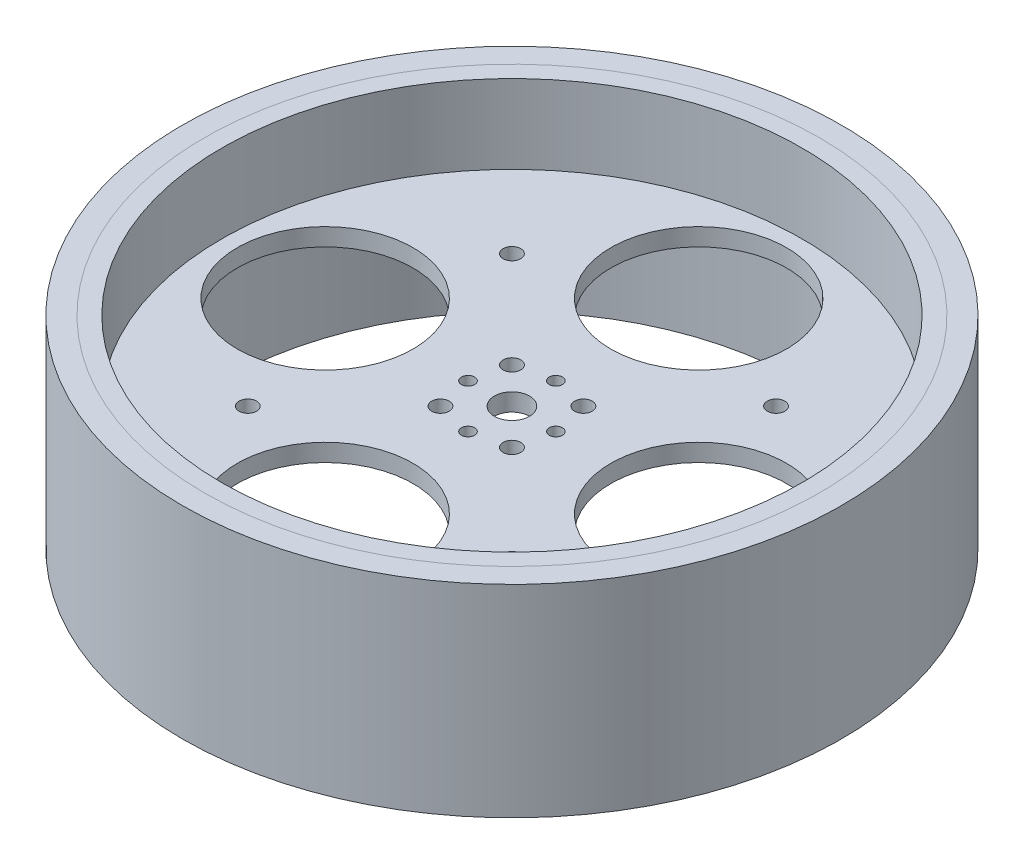
ISO-10303-21;
HEADER;
FILE_DESCRIPTION(('STEP AP214'),'2;1');
FILE_NAME('part.step','',(''),(''),'','','');
FILE_SCHEMA(('AUTOMOTIVE_DESIGN { 1 0 10303 214 1 1 1 1 }'));
ENDSEC;
DATA;
#1=APPLICATION_CONTEXT('core data for automotive mechanical design processes');
#2=APPLICATION_PROTOCOL_DEFINITION('international standard','automotive_design',2000,#1);
#3=PRODUCT_CONTEXT('',#1,'mechanical');
#4=PRODUCT('Part','Part','',(#3));
#5=PRODUCT_RELATED_PRODUCT_CATEGORY('part','',(#4));
#6=PRODUCT_DEFINITION_FORMATION('','',#4);
#7=PRODUCT_DEFINITION_CONTEXT('part definition',#1,'design');
#8=PRODUCT_DEFINITION('design','',#6,#7);
#9=PRODUCT_DEFINITION_SHAPE('','',#8);
#10=(LENGTH_UNIT() NAMED_UNIT(*) SI_UNIT(.MILLI.,.METRE.));
#11=(NAMED_UNIT(*) PLANE_ANGLE_UNIT() SI_UNIT($,.RADIAN.));
#12=(NAMED_UNIT(*) SI_UNIT($,.STERADIAN.) SOLID_ANGLE_UNIT());
#13=UNCERTAINTY_MEASURE_WITH_UNIT(LENGTH_MEASURE(1.E-05),#10,'distance_accuracy_value','');
#14=(GEOMETRIC_REPRESENTATION_CONTEXT(3) GLOBAL_UNCERTAINTY_ASSIGNED_CONTEXT((#13)) GLOBAL_UNIT_ASSIGNED_CONTEXT((#10,
#11,#12)) REPRESENTATION_CONTEXT('',''));
#15=CARTESIAN_POINT('',(0.,0.,0.));
#16=DIRECTION('',(0.,0.,1.));
#17=DIRECTION('',(1.,0.,0.));
#18=AXIS2_PLACEMENT_3D('',#15,#16,#17);
#19=CARTESIAN_POINT('',(0.,-26.1,0.));
#20=DIRECTION('',(0.,1.,0.));
#21=DIRECTION('',(0.,0.,1.));
#22=AXIS2_PLACEMENT_3D('',#19,#20,#21);
#23=CYLINDRICAL_SURFACE('',#22,70.);
#24=CARTESIAN_POINT('',(0.,-26.1,0.));
#25=DIRECTION('',(0.,1.,0.));
#26=DIRECTION('',(0.,0.,1.));
#27=AXIS2_PLACEMENT_3D('',#24,#25,#26);
#28=CIRCLE('',#27,70.);
#29=CARTESIAN_POINT('',(0.,-26.1,70.));
#30=VERTEX_POINT('',#29);
#31=EDGE_CURVE('E59',#30,#30,#28,.T.);
#32=ORIENTED_EDGE('',*,*,#31,.F.);
#33=EDGE_LOOP('',(#32));
#34=FACE_BOUND('',#33,.T.);
#35=CARTESIAN_POINT('',(0.,19.9,0.));
#36=DIRECTION('',(0.,1.,0.));
#37=DIRECTION('',(0.,0.,1.));
#38=AXIS2_PLACEMENT_3D('',#35,#36,#37);
#39=CIRCLE('',#38,70.);
#40=CARTESIAN_POINT('',(0.,19.9,70.));
#41=VERTEX_POINT('',#40);
#42=EDGE_CURVE('E67',#41,#41,#39,.T.);
#43=ORIENTED_EDGE('',*,*,#42,.T.);
#44=EDGE_LOOP('',(#43));
#45=FACE_BOUND('',#44,.T.);
#46=ADVANCED_FACE('F53',(#34,#45),#23,.F.);
#47=CARTESIAN_POINT('',(0.,-26.1,0.));
#48=DIRECTION('',(0.,1.,0.));
#49=DIRECTION('',(0.,0.,1.));
#50=AXIS2_PLACEMENT_3D('',#47,#48,#49);
#51=CYLINDRICAL_SURFACE('',#50,75.);
#52=CARTESIAN_POINT('',(0.,-26.1,0.));
#53=DIRECTION('',(0.,1.,0.));
#54=DIRECTION('',(0.,0.,1.));
#55=AXIS2_PLACEMENT_3D('',#52,#53,#54);
#56=CIRCLE('',#55,75.);
#57=CARTESIAN_POINT('',(0.,-26.1,75.));
#58=VERTEX_POINT('',#57);
#59=EDGE_CURVE('E11',#58,#58,#56,.T.);
#60=ORIENTED_EDGE('',*,*,#59,.T.);
#61=EDGE_LOOP('',(#60));
#62=FACE_BOUND('',#61,.T.);
#63=CARTESIAN_POINT('',(0.,19.9,0.));
#64=DIRECTION('',(0.,1.,0.));
#65=DIRECTION('',(0.,0.,1.));
#66=AXIS2_PLACEMENT_3D('',#63,#64,#65);
#67=CIRCLE('',#66,75.);
#68=CARTESIAN_POINT('',(0.,19.9,75.));
#69=VERTEX_POINT('',#68);
#70=EDGE_CURVE('E63',#69,#69,#67,.T.);
#71=ORIENTED_EDGE('',*,*,#70,.F.);
#72=EDGE_LOOP('',(#71));
#73=FACE_BOUND('',#72,.T.);
#74=ADVANCED_FACE('F81',(#62,#73),#51,.T.);
#75=CARTESIAN_POINT('',(0.,-26.1,0.));
#76=DIRECTION('',(0.,1.,0.));
#77=DIRECTION('',(0.,0.,1.));
#78=AXIS2_PLACEMENT_3D('',#75,#76,#77);
#79=PLANE('',#78);
#80=ORIENTED_EDGE('',*,*,#31,.T.);
#81=EDGE_LOOP('',(#80));
#82=FACE_BOUND('',#81,.T.);
#83=ORIENTED_EDGE('',*,*,#59,.F.);
#84=EDGE_LOOP('',(#83));
#85=FACE_BOUND('',#84,.T.);
#86=ADVANCED_FACE('F77',(#82,#85),#79,.F.);
#87=CARTESIAN_POINT('',(0.,19.9,0.));
#88=DIRECTION('',(0.,1.,0.));
#89=DIRECTION('',(0.,0.,1.));
#90=AXIS2_PLACEMENT_3D('',#87,#88,#89);
#91=PLANE('',#90);
#92=ORIENTED_EDGE('',*,*,#42,.F.);
#93=EDGE_LOOP('',(#92));
#94=FACE_BOUND('',#93,.T.);
#95=ORIENTED_EDGE('',*,*,#70,.T.);
#96=EDGE_LOOP('',(#95));
#97=FACE_BOUND('',#96,.T.);
#98=ADVANCED_FACE('F74',(#94,#97),#91,.T.);
#99=CLOSED_SHELL('',(#46,#74,#86,#98));
#100=MANIFOLD_SOLID_BREP('B2',#99);
#101=CARTESIAN_POINT('',(0.,-2.,0.));
#102=DIRECTION('',(0.,1.,0.));
#103=DIRECTION('',(0.,0.,1.));
#104=AXIS2_PLACEMENT_3D('',#101,#102,#103);
#105=CYLINDRICAL_SURFACE('',#104,4.);
#106=CARTESIAN_POINT('',(0.,-2.,0.));
#107=DIRECTION('',(0.,1.,0.));
#108=DIRECTION('',(0.,0.,1.));
#109=AXIS2_PLACEMENT_3D('',#106,#107,#108);
#110=CIRCLE('',#109,4.);
#111=CARTESIAN_POINT('',(0.,-2.,4.));
#112=VERTEX_POINT('',#111);
#113=EDGE_CURVE('E138',#112,#112,#110,.T.);
#114=ORIENTED_EDGE('',*,*,#113,.F.);
#115=EDGE_LOOP('',(#114));
#116=FACE_BOUND('',#115,.T.);
#117=CARTESIAN_POINT('',(0.,2.,0.));
#118=DIRECTION('',(0.,1.,0.));
#119=DIRECTION('',(0.,0.,1.));
#120=AXIS2_PLACEMENT_3D('',#117,#118,#119);
#121=CIRCLE('',#120,4.);
#122=CARTESIAN_POINT('',(0.,2.,4.));
#123=VERTEX_POINT('',#122);
#124=EDGE_CURVE('E193',#123,#123,#121,.T.);
#125=ORIENTED_EDGE('',*,*,#124,.T.);
#126=EDGE_LOOP('',(#125));
#127=FACE_BOUND('',#126,.T.);
#128=ADVANCED_FACE('F131',(#116,#127),#105,.F.);
#129=CARTESIAN_POINT('',(-10.,-2.,0.));
#130=DIRECTION('',(0.,1.,0.));
#131=DIRECTION('',(0.,0.,1.));
#132=AXIS2_PLACEMENT_3D('',#129,#130,#131);
#133=CYLINDRICAL_SURFACE('',#132,1.5);
#134=CARTESIAN_POINT('',(-10.,-2.,0.));
#135=DIRECTION('',(0.,1.,0.));
#136=DIRECTION('',(0.,0.,1.));
#137=AXIS2_PLACEMENT_3D('',#134,#135,#136);
#138=CIRCLE('',#137,1.5);
#139=CARTESIAN_POINT('',(-10.,-2.,1.5));
#140=VERTEX_POINT('',#139);
#141=EDGE_CURVE('E142',#140,#140,#138,.T.);
#142=ORIENTED_EDGE('',*,*,#141,.F.);
#143=EDGE_LOOP('',(#142));
#144=FACE_BOUND('',#143,.T.);
#145=CARTESIAN_POINT('',(-10.,2.,0.));
#146=DIRECTION('',(0.,1.,0.));
#147=DIRECTION('',(0.,0.,1.));
#148=AXIS2_PLACEMENT_3D('',#145,#146,#147);
#149=CIRCLE('',#148,1.5);
#150=CARTESIAN_POINT('',(-10.,2.,1.5));
#151=VERTEX_POINT('',#150);
#152=EDGE_CURVE('E196',#151,#151,#149,.T.);
#153=ORIENTED_EDGE('',*,*,#152,.T.);
#154=EDGE_LOOP('',(#153));
#155=FACE_BOUND('',#154,.T.);
#156=ADVANCED_FACE('F283',(#144,#155),#133,.F.);
#157=CARTESIAN_POINT('',(-8.13166793384599,-2.,8.13166793384599));
#158=DIRECTION('',(0.,1.,0.));
#159=DIRECTION('',(0.,0.,1.));
#160=AXIS2_PLACEMENT_3D('',#157,#158,#159);
#161=CYLINDRICAL_SURFACE('',#160,2.);
#162=CARTESIAN_POINT('',(-8.13166793384599,-2.,8.13166793384599));
#163=DIRECTION('',(0.,1.,0.));
#164=DIRECTION('',(0.,0.,1.));
#165=AXIS2_PLACEMENT_3D('',#162,#163,#164);
#166=CIRCLE('',#165,2.);
#167=CARTESIAN_POINT('',(-8.13166793384599,-2.,10.131667933846));
#168=VERTEX_POINT('',#167);
#169=EDGE_CURVE('E146',#168,#168,#166,.T.);
#170=ORIENTED_EDGE('',*,*,#169,.F.);
#171=EDGE_LOOP('',(#170));
#172=FACE_BOUND('',#171,.T.);
#173=CARTESIAN_POINT('',(-8.13166793384599,2.,8.13166793384599));
#174=DIRECTION('',(0.,1.,0.));
#175=DIRECTION('',(0.,0.,1.));
#176=AXIS2_PLACEMENT_3D('',#173,#174,#175);
#177=CIRCLE('',#176,2.);
#178=CARTESIAN_POINT('',(-8.13166793384599,2.,10.131667933846));
#179=VERTEX_POINT('',#178);
#180=EDGE_CURVE('E199',#179,#179,#177,.T.);
#181=ORIENTED_EDGE('',*,*,#180,.T.);
#182=EDGE_LOOP('',(#181));
#183=FACE_BOUND('',#182,.T.);
#184=ADVANCED_FACE('F289',(#172,#183),#161,.F.);
#185=CARTESIAN_POINT('',(-8.13166793384599,-2.,-8.13166793384599));
#186=DIRECTION('',(0.,1.,0.));
#187=DIRECTION('',(0.,0.,1.));
#188=AXIS2_PLACEMENT_3D('',#185,#186,#187);
#189=CYLINDRICAL_SURFACE('',#188,2.);
#190=CARTESIAN_POINT('',(-8.13166793384599,-2.,-8.13166793384599));
#191=DIRECTION('',(0.,1.,0.));
#192=DIRECTION('',(0.,0.,1.));
#193=AXIS2_PLACEMENT_3D('',#190,#191,#192);
#194=CIRCLE('',#193,2.);
#195=CARTESIAN_POINT('',(-8.13166793384599,-2.,-6.13166793384599));
#196=VERTEX_POINT('',#195);
#197=EDGE_CURVE('E151',#196,#196,#194,.T.);
#198=ORIENTED_EDGE('',*,*,#197,.F.);
#199=EDGE_LOOP('',(#198));
#200=FACE_BOUND('',#199,.T.);
#201=CARTESIAN_POINT('',(-8.13166793384599,2.,-8.13166793384599));
#202=DIRECTION('',(0.,1.,0.));
#203=DIRECTION('',(0.,0.,1.));
#204=AXIS2_PLACEMENT_3D('',#201,#202,#203);
#205=CIRCLE('',#204,2.);
#206=CARTESIAN_POINT('',(-8.13166793384599,2.,-6.13166793384599));
#207=VERTEX_POINT('',#206);
#208=EDGE_CURVE('E202',#207,#207,#205,.T.);
#209=ORIENTED_EDGE('',*,*,#208,.T.);
#210=EDGE_LOOP('',(#209));
#211=FACE_BOUND('',#210,.T.);
#212=ADVANCED_FACE('F299',(#200,#211),#189,.F.);
#213=CARTESIAN_POINT('',(8.13166793384599,-2.,-8.13166793384599));
#214=DIRECTION('',(0.,1.,0.));
#215=DIRECTION('',(0.,0.,1.));
#216=AXIS2_PLACEMENT_3D('',#213,#214,#215);
#217=CYLINDRICAL_SURFACE('',#216,2.);
#218=CARTESIAN_POINT('',(8.13166793384599,-2.,-8.13166793384599));
#219=DIRECTION('',(0.,1.,0.));
#220=DIRECTION('',(0.,0.,1.));
#221=AXIS2_PLACEMENT_3D('',#218,#219,#220);
#222=CIRCLE('',#221,2.);
#223=CARTESIAN_POINT('',(8.13166793384599,-2.,-6.13166793384599));
#224=VERTEX_POINT('',#223);
#225=EDGE_CURVE('E154',#224,#224,#222,.T.);
#226=ORIENTED_EDGE('',*,*,#225,.F.);
#227=EDGE_LOOP('',(#226));
#228=FACE_BOUND('',#227,.T.);
#229=CARTESIAN_POINT('',(8.13166793384599,2.,-8.13166793384599));
#230=DIRECTION('',(0.,1.,0.));
#231=DIRECTION('',(0.,0.,1.));
#232=AXIS2_PLACEMENT_3D('',#229,#230,#231);
#233=CIRCLE('',#232,2.);
#234=CARTESIAN_POINT('',(8.13166793384599,2.,-6.13166793384599));
#235=VERTEX_POINT('',#234);
#236=EDGE_CURVE('E205',#235,#235,#233,.T.);
#237=ORIENTED_EDGE('',*,*,#236,.T.);
#238=EDGE_LOOP('',(#237));
#239=FACE_BOUND('',#238,.T.);
#240=ADVANCED_FACE('F303',(#228,#239),#217,.F.);
#241=CARTESIAN_POINT('',(8.13166793384599,-2.,8.13166793384599));
#242=DIRECTION('',(0.,1.,0.));
#243=DIRECTION('',(0.,0.,1.));
#244=AXIS2_PLACEMENT_3D('',#241,#242,#243);
#245=CYLINDRICAL_SURFACE('',#244,2.);
#246=CARTESIAN_POINT('',(8.13166793384599,-2.,8.13166793384599));
#247=DIRECTION('',(0.,1.,0.));
#248=DIRECTION('',(0.,0.,1.));
#249=AXIS2_PLACEMENT_3D('',#246,#247,#248);
#250=CIRCLE('',#249,2.);
#251=CARTESIAN_POINT('',(8.13166793384599,-2.,10.131667933846));
#252=VERTEX_POINT('',#251);
#253=EDGE_CURVE('E157',#252,#252,#250,.T.);
#254=ORIENTED_EDGE('',*,*,#253,.F.);
#255=EDGE_LOOP('',(#254));
#256=FACE_BOUND('',#255,.T.);
#257=CARTESIAN_POINT('',(8.13166793384599,2.,8.13166793384599));
#258=DIRECTION('',(0.,1.,0.));
#259=DIRECTION('',(0.,0.,1.));
#260=AXIS2_PLACEMENT_3D('',#257,#258,#259);
#261=CIRCLE('',#260,2.);
#262=CARTESIAN_POINT('',(8.13166793384599,2.,10.131667933846));
#263=VERTEX_POINT('',#262);
#264=EDGE_CURVE('E208',#263,#263,#261,.T.);
#265=ORIENTED_EDGE('',*,*,#264,.T.);
#266=EDGE_LOOP('',(#265));
#267=FACE_BOUND('',#266,.T.);
#268=ADVANCED_FACE('F307',(#256,#267),#245,.F.);
#269=CARTESIAN_POINT('',(0.,-2.,-10.));
#270=DIRECTION('',(0.,1.,0.));
#271=DIRECTION('',(0.,0.,1.));
#272=AXIS2_PLACEMENT_3D('',#269,#270,#271);
#273=CYLINDRICAL_SURFACE('',#272,1.5);
#274=CARTESIAN_POINT('',(0.,-2.,-10.));
#275=DIRECTION('',(0.,1.,0.));
#276=DIRECTION('',(0.,0.,1.));
#277=AXIS2_PLACEMENT_3D('',#274,#275,#276);
#278=CIRCLE('',#277,1.5);
#279=CARTESIAN_POINT('',(0.,-2.,-8.5));
#280=VERTEX_POINT('',#279);
#281=EDGE_CURVE('E160',#280,#280,#278,.T.);
#282=ORIENTED_EDGE('',*,*,#281,.F.);
#283=EDGE_LOOP('',(#282));
#284=FACE_BOUND('',#283,.T.);
#285=CARTESIAN_POINT('',(0.,2.,-10.));
#286=DIRECTION('',(0.,1.,0.));
#287=DIRECTION('',(0.,0.,1.));
#288=AXIS2_PLACEMENT_3D('',#285,#286,#287);
#289=CIRCLE('',#288,1.5);
#290=CARTESIAN_POINT('',(0.,2.,-8.5));
#291=VERTEX_POINT('',#290);
#292=EDGE_CURVE('E211',#291,#291,#289,.T.);
#293=ORIENTED_EDGE('',*,*,#292,.T.);
#294=EDGE_LOOP('',(#293));
#295=FACE_BOUND('',#294,.T.);
#296=ADVANCED_FACE('F311',(#284,#295),#273,.F.);
#297=CARTESIAN_POINT('',(10.,-2.,0.));
#298=DIRECTION('',(0.,1.,0.));
#299=DIRECTION('',(0.,0.,1.));
#300=AXIS2_PLACEMENT_3D('',#297,#298,#299);
#301=CYLINDRICAL_SURFACE('',#300,1.5);
#302=CARTESIAN_POINT('',(10.,-2.,0.));
#303=DIRECTION('',(0.,1.,0.));
#304=DIRECTION('',(0.,0.,1.));
#305=AXIS2_PLACEMENT_3D('',#302,#303,#304);
#306=CIRCLE('',#305,1.5);
#307=CARTESIAN_POINT('',(10.,-2.,1.5));
#308=VERTEX_POINT('',#307);
#309=EDGE_CURVE('E163',#308,#308,#306,.T.);
#310=ORIENTED_EDGE('',*,*,#309,.F.);
#311=EDGE_LOOP('',(#310));
#312=FACE_BOUND('',#311,.T.);
#313=CARTESIAN_POINT('',(10.,2.,0.));
#314=DIRECTION('',(0.,1.,0.));
#315=DIRECTION('',(0.,0.,1.));
#316=AXIS2_PLACEMENT_3D('',#313,#314,#315);
#317=CIRCLE('',#316,1.5);
#318=CARTESIAN_POINT('',(10.,2.,1.5));
#319=VERTEX_POINT('',#318);
#320=EDGE_CURVE('E214',#319,#319,#317,.T.);
#321=ORIENTED_EDGE('',*,*,#320,.T.);
#322=EDGE_LOOP('',(#321));
#323=FACE_BOUND('',#322,.T.);
#324=ADVANCED_FACE('F315',(#312,#323),#301,.F.);
#325=CARTESIAN_POINT('',(0.,-2.,10.));
#326=DIRECTION('',(0.,1.,0.));
#327=DIRECTION('',(0.,0.,1.));
#328=AXIS2_PLACEMENT_3D('',#325,#326,#327);
#329=CYLINDRICAL_SURFACE('',#328,1.5);
#330=CARTESIAN_POINT('',(0.,-2.,10.));
#331=DIRECTION('',(0.,1.,0.));
#332=DIRECTION('',(0.,0.,1.));
#333=AXIS2_PLACEMENT_3D('',#330,#331,#332);
#334=CIRCLE('',#333,1.5);
#335=CARTESIAN_POINT('',(0.,-2.,11.5));
#336=VERTEX_POINT('',#335);
#337=EDGE_CURVE('E166',#336,#336,#334,.T.);
#338=ORIENTED_EDGE('',*,*,#337,.F.);
#339=EDGE_LOOP('',(#338));
#340=FACE_BOUND('',#339,.T.);
#341=CARTESIAN_POINT('',(0.,2.,10.));
#342=DIRECTION('',(0.,1.,0.));
#343=DIRECTION('',(0.,0.,1.));
#344=AXIS2_PLACEMENT_3D('',#341,#342,#343);
#345=CIRCLE('',#344,1.5);
#346=CARTESIAN_POINT('',(0.,2.,11.5));
#347=VERTEX_POINT('',#346);
#348=EDGE_CURVE('E217',#347,#347,#345,.T.);
#349=ORIENTED_EDGE('',*,*,#348,.T.);
#350=EDGE_LOOP('',(#349));
#351=FACE_BOUND('',#350,.T.);
#352=ADVANCED_FACE('F319',(#340,#351),#329,.F.);
#353=CARTESIAN_POINT('',(-42.5,-2.,0.));
#354=DIRECTION('',(0.,1.,0.));
#355=DIRECTION('',(0.,0.,1.));
#356=AXIS2_PLACEMENT_3D('',#353,#354,#355);
#357=CYLINDRICAL_SURFACE('',#356,20.);
#358=CARTESIAN_POINT('',(-42.5,-2.,0.));
#359=DIRECTION('',(0.,1.,0.));
#360=DIRECTION('',(0.,0.,1.));
#361=AXIS2_PLACEMENT_3D('',#358,#359,#360);
#362=CIRCLE('',#361,20.);
#363=CARTESIAN_POINT('',(-42.5,-2.,20.));
#364=VERTEX_POINT('',#363);
#365=EDGE_CURVE('E169',#364,#364,#362,.T.);
#366=ORIENTED_EDGE('',*,*,#365,.F.);
#367=EDGE_LOOP('',(#366));
#368=FACE_BOUND('',#367,.T.);
#369=CARTESIAN_POINT('',(-42.5,2.,0.));
#370=DIRECTION('',(0.,1.,0.));
#371=DIRECTION('',(0.,0.,1.));
#372=AXIS2_PLACEMENT_3D('',#369,#370,#371);
#373=CIRCLE('',#372,20.);
#374=CARTESIAN_POINT('',(-42.5,2.,20.));
#375=VERTEX_POINT('',#374);
#376=EDGE_CURVE('E220',#375,#375,#373,.T.);
#377=ORIENTED_EDGE('',*,*,#376,.T.);
#378=EDGE_LOOP('',(#377));
#379=FACE_BOUND('',#378,.T.);
#380=ADVANCED_FACE('F323',(#368,#379),#357,.F.);
#381=CARTESIAN_POINT('',(0.,-2.,-42.5));
#382=DIRECTION('',(0.,1.,0.));
#383=DIRECTION('',(0.,0.,1.));
#384=AXIS2_PLACEMENT_3D('',#381,#382,#383);
#385=CYLINDRICAL_SURFACE('',#384,20.);
#386=CARTESIAN_POINT('',(0.,-2.,-42.5));
#387=DIRECTION('',(0.,1.,0.));
#388=DIRECTION('',(0.,0.,1.));
#389=AXIS2_PLACEMENT_3D('',#386,#387,#388);
#390=CIRCLE('',#389,20.);
#391=CARTESIAN_POINT('',(0.,-2.,-22.5));
#392=VERTEX_POINT('',#391);
#393=EDGE_CURVE('E172',#392,#392,#390,.T.);
#394=ORIENTED_EDGE('',*,*,#393,.F.);
#395=EDGE_LOOP('',(#394));
#396=FACE_BOUND('',#395,.T.);
#397=CARTESIAN_POINT('',(0.,2.,-42.5));
#398=DIRECTION('',(0.,1.,0.));
#399=DIRECTION('',(0.,0.,1.));
#400=AXIS2_PLACEMENT_3D('',#397,#398,#399);
#401=CIRCLE('',#400,20.);
#402=CARTESIAN_POINT('',(0.,2.,-22.5));
#403=VERTEX_POINT('',#402);
#404=EDGE_CURVE('E223',#403,#403,#401,.T.);
#405=ORIENTED_EDGE('',*,*,#404,.T.);
#406=EDGE_LOOP('',(#405));
#407=FACE_BOUND('',#406,.T.);
#408=ADVANCED_FACE('F327',(#396,#407),#385,.F.);
#409=CARTESIAN_POINT('',(42.5,-2.,0.));
#410=DIRECTION('',(0.,1.,0.));
#411=DIRECTION('',(0.,0.,1.));
#412=AXIS2_PLACEMENT_3D('',#409,#410,#411);
#413=CYLINDRICAL_SURFACE('',#412,20.);
#414=CARTESIAN_POINT('',(42.5,-2.,0.));
#415=DIRECTION('',(0.,1.,0.));
#416=DIRECTION('',(0.,0.,1.));
#417=AXIS2_PLACEMENT_3D('',#414,#415,#416);
#418=CIRCLE('',#417,20.);
#419=CARTESIAN_POINT('',(42.5,-2.,20.));
#420=VERTEX_POINT('',#419);
#421=EDGE_CURVE('E175',#420,#420,#418,.T.);
#422=ORIENTED_EDGE('',*,*,#421,.F.);
#423=EDGE_LOOP('',(#422));
#424=FACE_BOUND('',#423,.T.);
#425=CARTESIAN_POINT('',(42.5,2.,0.));
#426=DIRECTION('',(0.,1.,0.));
#427=DIRECTION('',(0.,0.,1.));
#428=AXIS2_PLACEMENT_3D('',#425,#426,#427);
#429=CIRCLE('',#428,20.);
#430=CARTESIAN_POINT('',(42.5,2.,20.));
#431=VERTEX_POINT('',#430);
#432=EDGE_CURVE('E226',#431,#431,#429,.T.);
#433=ORIENTED_EDGE('',*,*,#432,.T.);
#434=EDGE_LOOP('',(#433));
#435=FACE_BOUND('',#434,.T.);
#436=ADVANCED_FACE('F331',(#424,#435),#413,.F.);
#437=CARTESIAN_POINT('',(0.,-2.,42.5));
#438=DIRECTION('',(0.,1.,0.));
#439=DIRECTION('',(0.,0.,1.));
#440=AXIS2_PLACEMENT_3D('',#437,#438,#439);
#441=CYLINDRICAL_SURFACE('',#440,20.);
#442=CARTESIAN_POINT('',(0.,-2.,42.5));
#443=DIRECTION('',(0.,1.,0.));
#444=DIRECTION('',(0.,0.,1.));
#445=AXIS2_PLACEMENT_3D('',#442,#443,#444);
#446=CIRCLE('',#445,20.);
#447=CARTESIAN_POINT('',(0.,-2.,62.5));
#448=VERTEX_POINT('',#447);
#449=EDGE_CURVE('E178',#448,#448,#446,.T.);
#450=ORIENTED_EDGE('',*,*,#449,.F.);
#451=EDGE_LOOP('',(#450));
#452=FACE_BOUND('',#451,.T.);
#453=CARTESIAN_POINT('',(0.,2.,42.5));
#454=DIRECTION('',(0.,1.,0.));
#455=DIRECTION('',(0.,0.,1.));
#456=AXIS2_PLACEMENT_3D('',#453,#454,#455);
#457=CIRCLE('',#456,20.);
#458=CARTESIAN_POINT('',(0.,2.,62.5));
#459=VERTEX_POINT('',#458);
#460=EDGE_CURVE('E229',#459,#459,#457,.T.);
#461=ORIENTED_EDGE('',*,*,#460,.T.);
#462=EDGE_LOOP('',(#461));
#463=FACE_BOUND('',#462,.T.);
#464=ADVANCED_FACE('F335',(#452,#463),#441,.F.);
#465=CARTESIAN_POINT('',(-30.0520382004283,-2.,30.0520382004283));
#466=DIRECTION('',(0.,1.,0.));
#467=DIRECTION('',(0.,0.,1.));
#468=AXIS2_PLACEMENT_3D('',#465,#466,#467);
#469=CYLINDRICAL_SURFACE('',#468,2.);
#470=CARTESIAN_POINT('',(-30.0520382004283,-2.,30.0520382004283));
#471=DIRECTION('',(0.,1.,0.));
#472=DIRECTION('',(0.,0.,1.));
#473=AXIS2_PLACEMENT_3D('',#470,#471,#472);
#474=CIRCLE('',#473,2.);
#475=CARTESIAN_POINT('',(-30.0520382004283,-2.,32.0520382004283));
#476=VERTEX_POINT('',#475);
#477=EDGE_CURVE('E181',#476,#476,#474,.T.);
#478=ORIENTED_EDGE('',*,*,#477,.F.);
#479=EDGE_LOOP('',(#478));
#480=FACE_BOUND('',#479,.T.);
#481=CARTESIAN_POINT('',(-30.0520382004283,2.,30.0520382004283));
#482=DIRECTION('',(0.,1.,0.));
#483=DIRECTION('',(0.,0.,1.));
#484=AXIS2_PLACEMENT_3D('',#481,#482,#483);
#485=CIRCLE('',#484,2.);
#486=CARTESIAN_POINT('',(-30.0520382004283,2.,32.0520382004283));
#487=VERTEX_POINT('',#486);
#488=EDGE_CURVE('E232',#487,#487,#485,.T.);
#489=ORIENTED_EDGE('',*,*,#488,.T.);
#490=EDGE_LOOP('',(#489));
#491=FACE_BOUND('',#490,.T.);
#492=ADVANCED_FACE('F339',(#480,#491),#469,.F.);
#493=CARTESIAN_POINT('',(-30.0520382004282,-2.,-30.0520382004284));
#494=DIRECTION('',(0.,1.,0.));
#495=DIRECTION('',(0.,0.,1.));
#496=AXIS2_PLACEMENT_3D('',#493,#494,#495);
#497=CYLINDRICAL_SURFACE('',#496,2.);
#498=CARTESIAN_POINT('',(-30.0520382004282,-2.,-30.0520382004284));
#499=DIRECTION('',(0.,1.,0.));
#500=DIRECTION('',(0.,0.,1.));
#501=AXIS2_PLACEMENT_3D('',#498,#499,#500);
#502=CIRCLE('',#501,2.);
#503=CARTESIAN_POINT('',(-30.0520382004282,-2.,-28.0520382004284));
#504=VERTEX_POINT('',#503);
#505=EDGE_CURVE('E184',#504,#504,#502,.T.);
#506=ORIENTED_EDGE('',*,*,#505,.F.);
#507=EDGE_LOOP('',(#506));
#508=FACE_BOUND('',#507,.T.);
#509=CARTESIAN_POINT('',(-30.0520382004282,2.,-30.0520382004284));
#510=DIRECTION('',(0.,1.,0.));
#511=DIRECTION('',(0.,0.,1.));
#512=AXIS2_PLACEMENT_3D('',#509,#510,#511);
#513=CIRCLE('',#512,2.);
#514=CARTESIAN_POINT('',(-30.0520382004282,2.,-28.0520382004284));
#515=VERTEX_POINT('',#514);
#516=EDGE_CURVE('E235',#515,#515,#513,.T.);
#517=ORIENTED_EDGE('',*,*,#516,.T.);
#518=EDGE_LOOP('',(#517));
#519=FACE_BOUND('',#518,.T.);
#520=ADVANCED_FACE('F343',(#508,#519),#497,.F.);
#521=CARTESIAN_POINT('',(30.0520382004285,-2.,-30.0520382004281));
#522=DIRECTION('',(0.,1.,0.));
#523=DIRECTION('',(0.,0.,1.));
#524=AXIS2_PLACEMENT_3D('',#521,#522,#523);
#525=CYLINDRICAL_SURFACE('',#524,2.);
#526=CARTESIAN_POINT('',(30.0520382004285,-2.,-30.0520382004281));
#527=DIRECTION('',(0.,1.,0.));
#528=DIRECTION('',(0.,0.,1.));
#529=AXIS2_PLACEMENT_3D('',#526,#527,#528);
#530=CIRCLE('',#529,2.);
#531=CARTESIAN_POINT('',(30.0520382004285,-2.,-28.0520382004281));
#532=VERTEX_POINT('',#531);
#533=EDGE_CURVE('E187',#532,#532,#530,.T.);
#534=ORIENTED_EDGE('',*,*,#533,.F.);
#535=EDGE_LOOP('',(#534));
#536=FACE_BOUND('',#535,.T.);
#537=CARTESIAN_POINT('',(30.0520382004285,2.,-30.0520382004281));
#538=DIRECTION('',(0.,1.,0.));
#539=DIRECTION('',(0.,0.,1.));
#540=AXIS2_PLACEMENT_3D('',#537,#538,#539);
#541=CIRCLE('',#540,2.);
#542=CARTESIAN_POINT('',(30.0520382004285,2.,-28.0520382004281));
#543=VERTEX_POINT('',#542);
#544=EDGE_CURVE('E238',#543,#543,#541,.T.);
#545=ORIENTED_EDGE('',*,*,#544,.T.);
#546=EDGE_LOOP('',(#545));
#547=FACE_BOUND('',#546,.T.);
#548=ADVANCED_FACE('F346',(#536,#547),#525,.F.);
#549=CARTESIAN_POINT('',(30.052038200428,-2.,30.0520382004286));
#550=DIRECTION('',(0.,1.,0.));
#551=DIRECTION('',(0.,0.,1.));
#552=AXIS2_PLACEMENT_3D('',#549,#550,#551);
#553=CYLINDRICAL_SURFACE('',#552,2.);
#554=CARTESIAN_POINT('',(30.052038200428,-2.,30.0520382004286));
#555=DIRECTION('',(0.,1.,0.));
#556=DIRECTION('',(0.,0.,1.));
#557=AXIS2_PLACEMENT_3D('',#554,#555,#556);
#558=CIRCLE('',#557,2.);
#559=CARTESIAN_POINT('',(30.052038200428,-2.,32.0520382004286));
#560=VERTEX_POINT('',#559);
#561=EDGE_CURVE('E190',#560,#560,#558,.T.);
#562=ORIENTED_EDGE('',*,*,#561,.F.);
#563=EDGE_LOOP('',(#562));
#564=FACE_BOUND('',#563,.T.);
#565=CARTESIAN_POINT('',(30.052038200428,2.,30.0520382004286));
#566=DIRECTION('',(0.,1.,0.));
#567=DIRECTION('',(0.,0.,1.));
#568=AXIS2_PLACEMENT_3D('',#565,#566,#567);
#569=CIRCLE('',#568,2.);
#570=CARTESIAN_POINT('',(30.052038200428,2.,32.0520382004286));
#571=VERTEX_POINT('',#570);
#572=EDGE_CURVE('E241',#571,#571,#569,.T.);
#573=ORIENTED_EDGE('',*,*,#572,.T.);
#574=EDGE_LOOP('',(#573));
#575=FACE_BOUND('',#574,.T.);
#576=ADVANCED_FACE('F133',(#564,#575),#553,.F.);
#577=CARTESIAN_POINT('',(0.,-2.,0.));
#578=DIRECTION('',(0.,1.,0.));
#579=DIRECTION('',(0.,0.,1.));
#580=AXIS2_PLACEMENT_3D('',#577,#578,#579);
#581=PLANE('',#580);
#582=ORIENTED_EDGE('',*,*,#561,.T.);
#583=EDGE_LOOP('',(#582));
#584=FACE_BOUND('',#583,.T.);
#585=ORIENTED_EDGE('',*,*,#533,.T.);
#586=EDGE_LOOP('',(#585));
#587=FACE_BOUND('',#586,.T.);
#588=ORIENTED_EDGE('',*,*,#505,.T.);
#589=EDGE_LOOP('',(#588));
#590=FACE_BOUND('',#589,.T.);
#591=ORIENTED_EDGE('',*,*,#477,.T.);
#592=EDGE_LOOP('',(#591));
#593=FACE_BOUND('',#592,.T.);
#594=ORIENTED_EDGE('',*,*,#449,.T.);
#595=EDGE_LOOP('',(#594));
#596=FACE_BOUND('',#595,.T.);
#597=ORIENTED_EDGE('',*,*,#421,.T.);
#598=EDGE_LOOP('',(#597));
#599=FACE_BOUND('',#598,.T.);
#600=ORIENTED_EDGE('',*,*,#393,.T.);
#601=EDGE_LOOP('',(#600));
#602=FACE_BOUND('',#601,.T.);
#603=ORIENTED_EDGE('',*,*,#365,.T.);
#604=EDGE_LOOP('',(#603));
#605=FACE_BOUND('',#604,.T.);
#606=ORIENTED_EDGE('',*,*,#337,.T.);
#607=EDGE_LOOP('',(#606));
#608=FACE_BOUND('',#607,.T.);
#609=ORIENTED_EDGE('',*,*,#309,.T.);
#610=EDGE_LOOP('',(#609));
#611=FACE_BOUND('',#610,.T.);
#612=ORIENTED_EDGE('',*,*,#281,.T.);
#613=EDGE_LOOP('',(#612));
#614=FACE_BOUND('',#613,.T.);
#615=ORIENTED_EDGE('',*,*,#253,.T.);
#616=EDGE_LOOP('',(#615));
#617=FACE_BOUND('',#616,.T.);
#618=ORIENTED_EDGE('',*,*,#225,.T.);
#619=EDGE_LOOP('',(#618));
#620=FACE_BOUND('',#619,.T.);
#621=ORIENTED_EDGE('',*,*,#197,.T.);
#622=EDGE_LOOP('',(#621));
#623=FACE_BOUND('',#622,.T.);
#624=ORIENTED_EDGE('',*,*,#169,.T.);
#625=EDGE_LOOP('',(#624));
#626=FACE_BOUND('',#625,.T.);
#627=ORIENTED_EDGE('',*,*,#141,.T.);
#628=EDGE_LOOP('',(#627));
#629=FACE_BOUND('',#628,.T.);
#630=ORIENTED_EDGE('',*,*,#113,.T.);
#631=EDGE_LOOP('',(#630));
#632=FACE_BOUND('',#631,.T.);
#633=CARTESIAN_POINT('',(0.,-2.,0.));
#634=DIRECTION('',(0.,1.,0.));
#635=DIRECTION('',(0.,0.,1.));
#636=AXIS2_PLACEMENT_3D('',#633,#634,#635);
#637=CIRCLE('',#636,66.);
#638=CARTESIAN_POINT('',(0.,-2.,66.));
#639=VERTEX_POINT('',#638);
#640=EDGE_CURVE('E52',#639,#639,#637,.T.);
#641=ORIENTED_EDGE('',*,*,#640,.F.);
#642=EDGE_LOOP('',(#641));
#643=FACE_BOUND('',#642,.T.);
#644=ADVANCED_FACE('F294',(#584,#587,#590,#593,#596,#599,#602,#605,#608,#611,#614,#617,#620,
#623,#626,#629,#632,#643),#581,.F.);
#645=CARTESIAN_POINT('',(0.,2.,0.));
#646=DIRECTION('',(0.,1.,0.));
#647=DIRECTION('',(0.,0.,1.));
#648=AXIS2_PLACEMENT_3D('',#645,#646,#647);
#649=PLANE('',#648);
#650=ORIENTED_EDGE('',*,*,#572,.F.);
#651=EDGE_LOOP('',(#650));
#652=FACE_BOUND('',#651,.T.);
#653=ORIENTED_EDGE('',*,*,#544,.F.);
#654=EDGE_LOOP('',(#653));
#655=FACE_BOUND('',#654,.T.);
#656=ORIENTED_EDGE('',*,*,#516,.F.);
#657=EDGE_LOOP('',(#656));
#658=FACE_BOUND('',#657,.T.);
#659=ORIENTED_EDGE('',*,*,#488,.F.);
#660=EDGE_LOOP('',(#659));
#661=FACE_BOUND('',#660,.T.);
#662=ORIENTED_EDGE('',*,*,#460,.F.);
#663=EDGE_LOOP('',(#662));
#664=FACE_BOUND('',#663,.T.);
#665=ORIENTED_EDGE('',*,*,#432,.F.);
#666=EDGE_LOOP('',(#665));
#667=FACE_BOUND('',#666,.T.);
#668=ORIENTED_EDGE('',*,*,#404,.F.);
#669=EDGE_LOOP('',(#668));
#670=FACE_BOUND('',#669,.T.);
#671=ORIENTED_EDGE('',*,*,#376,.F.);
#672=EDGE_LOOP('',(#671));
#673=FACE_BOUND('',#672,.T.);
#674=ORIENTED_EDGE('',*,*,#348,.F.);
#675=EDGE_LOOP('',(#674));
#676=FACE_BOUND('',#675,.T.);
#677=ORIENTED_EDGE('',*,*,#320,.F.);
#678=EDGE_LOOP('',(#677));
#679=FACE_BOUND('',#678,.T.);
#680=ORIENTED_EDGE('',*,*,#292,.F.);
#681=EDGE_LOOP('',(#680));
#682=FACE_BOUND('',#681,.T.);
#683=ORIENTED_EDGE('',*,*,#264,.F.);
#684=EDGE_LOOP('',(#683));
#685=FACE_BOUND('',#684,.T.);
#686=ORIENTED_EDGE('',*,*,#236,.F.);
#687=EDGE_LOOP('',(#686));
#688=FACE_BOUND('',#687,.T.);
#689=ORIENTED_EDGE('',*,*,#208,.F.);
#690=EDGE_LOOP('',(#689));
#691=FACE_BOUND('',#690,.T.);
#692=ORIENTED_EDGE('',*,*,#180,.F.);
#693=EDGE_LOOP('',(#692));
#694=FACE_BOUND('',#693,.T.);
#695=ORIENTED_EDGE('',*,*,#152,.F.);
#696=EDGE_LOOP('',(#695));
#697=FACE_BOUND('',#696,.T.);
#698=ORIENTED_EDGE('',*,*,#124,.F.);
#699=EDGE_LOOP('',(#698));
#700=FACE_BOUND('',#699,.T.);
#701=CARTESIAN_POINT('',(0.,2.,0.));
#702=DIRECTION('',(0.,1.,0.));
#703=DIRECTION('',(0.,0.,1.));
#704=AXIS2_PLACEMENT_3D('',#701,#702,#703);
#705=CIRCLE('',#704,66.);
#706=CARTESIAN_POINT('',(0.,2.,66.));
#707=VERTEX_POINT('',#706);
#708=EDGE_CURVE('E244',#707,#707,#705,.T.);
#709=ORIENTED_EDGE('',*,*,#708,.T.);
#710=EDGE_LOOP('',(#709));
#711=FACE_BOUND('',#710,.T.);
#712=ADVANCED_FACE('F358',(#652,#655,#658,#661,#664,#667,#670,#673,#676,#679,#682,#685,#688,
#691,#694,#697,#700,#711),#649,.T.);
#713=CARTESIAN_POINT('',(0.,-26.1,0.));
#714=DIRECTION('',(0.,1.,0.));
#715=DIRECTION('',(0.,0.,1.));
#716=AXIS2_PLACEMENT_3D('',#713,#714,#715);
#717=CYLINDRICAL_SURFACE('',#716,66.);
#718=CARTESIAN_POINT('',(0.,-26.1,0.));
#719=DIRECTION('',(0.,1.,0.));
#720=DIRECTION('',(0.,0.,1.));
#721=AXIS2_PLACEMENT_3D('',#718,#719,#720);
#722=CIRCLE('',#721,66.);
#723=CARTESIAN_POINT('',(0.,-26.1,66.));
#724=VERTEX_POINT('',#723);
#725=EDGE_CURVE('E250',#724,#724,#722,.T.);
#726=ORIENTED_EDGE('',*,*,#725,.F.);
#727=EDGE_LOOP('',(#726));
#728=FACE_BOUND('',#727,.T.);
#729=ORIENTED_EDGE('',*,*,#640,.T.);
#730=EDGE_LOOP('',(#729));
#731=FACE_BOUND('',#730,.T.);
#732=ADVANCED_FACE('F279',(#728,#731),#717,.F.);
#733=ORIENTED_EDGE('',*,*,#708,.F.);
#734=EDGE_LOOP('',(#733));
#735=FACE_BOUND('',#734,.T.);
#736=CARTESIAN_POINT('',(0.,19.9,0.));
#737=DIRECTION('',(0.,1.,0.));
#738=DIRECTION('',(0.,0.,1.));
#739=AXIS2_PLACEMENT_3D('',#736,#737,#738);
#740=CIRCLE('',#739,66.);
#741=CARTESIAN_POINT('',(0.,19.9,66.));
#742=VERTEX_POINT('',#741);
#743=EDGE_CURVE('E256',#742,#742,#740,.T.);
#744=ORIENTED_EDGE('',*,*,#743,.T.);
#745=EDGE_LOOP('',(#744));
#746=FACE_BOUND('',#745,.T.);
#747=ADVANCED_FACE('F260',(#735,#746),#717,.F.);
#748=CARTESIAN_POINT('',(0.,-26.1,0.));
#749=DIRECTION('',(0.,1.,0.));
#750=DIRECTION('',(0.,0.,1.));
#751=AXIS2_PLACEMENT_3D('',#748,#749,#750);
#752=CYLINDRICAL_SURFACE('',#751,70.);
#753=CARTESIAN_POINT('',(0.,-26.1,0.));
#754=DIRECTION('',(0.,1.,0.));
#755=DIRECTION('',(0.,0.,1.));
#756=AXIS2_PLACEMENT_3D('',#753,#754,#755);
#757=CIRCLE('',#756,70.);
#758=CARTESIAN_POINT('',(0.,-26.1,70.));
#759=VERTEX_POINT('',#758);
#760=EDGE_CURVE('E247',#759,#759,#757,.T.);
#761=ORIENTED_EDGE('',*,*,#760,.T.);
#762=EDGE_LOOP('',(#761));
#763=FACE_BOUND('',#762,.T.);
#764=CARTESIAN_POINT('',(0.,19.9,0.));
#765=DIRECTION('',(0.,1.,0.));
#766=DIRECTION('',(0.,0.,1.));
#767=AXIS2_PLACEMENT_3D('',#764,#765,#766);
#768=CIRCLE('',#767,70.);
#769=CARTESIAN_POINT('',(0.,19.9,70.));
#770=VERTEX_POINT('',#769);
#771=EDGE_CURVE('E253',#770,#770,#768,.T.);
#772=ORIENTED_EDGE('',*,*,#771,.F.);
#773=EDGE_LOOP('',(#772));
#774=FACE_BOUND('',#773,.T.);
#775=ADVANCED_FACE('F269',(#763,#774),#752,.T.);
#776=CARTESIAN_POINT('',(0.,-26.1,0.));
#777=DIRECTION('',(0.,1.,0.));
#778=DIRECTION('',(0.,0.,1.));
#779=AXIS2_PLACEMENT_3D('',#776,#777,#778);
#780=PLANE('',#779);
#781=ORIENTED_EDGE('',*,*,#725,.T.);
#782=EDGE_LOOP('',(#781));
#783=FACE_BOUND('',#782,.T.);
#784=ORIENTED_EDGE('',*,*,#760,.F.);
#785=EDGE_LOOP('',(#784));
#786=FACE_BOUND('',#785,.T.);
#787=ADVANCED_FACE('F265',(#783,#786),#780,.F.);
#788=CARTESIAN_POINT('',(0.,19.9,0.));
#789=DIRECTION('',(0.,1.,0.));
#790=DIRECTION('',(0.,0.,1.));
#791=AXIS2_PLACEMENT_3D('',#788,#789,#790);
#792=PLANE('',#791);
#793=ORIENTED_EDGE('',*,*,#743,.F.);
#794=EDGE_LOOP('',(#793));
#795=FACE_BOUND('',#794,.T.);
#796=ORIENTED_EDGE('',*,*,#771,.T.);
#797=EDGE_LOOP('',(#796));
#798=FACE_BOUND('',#797,.T.);
#799=ADVANCED_FACE('F262',(#795,#798),#792,.T.);
#800=CLOSED_SHELL('',(#128,#156,#184,#212,#240,#268,#296,#324,#352,#380,#408,#436,#464,#492,
#520,#548,#576,#644,#712,#732,#747,#775,#787,#799));
#801=MANIFOLD_SOLID_BREP('B6',#800);
#802=ADVANCED_BREP_SHAPE_REPRESENTATION('',(#18,#100,#801),#14);
#803=SHAPE_DEFINITION_REPRESENTATION(#9,#802);
ENDSEC;
END-ISO-10303-21;
